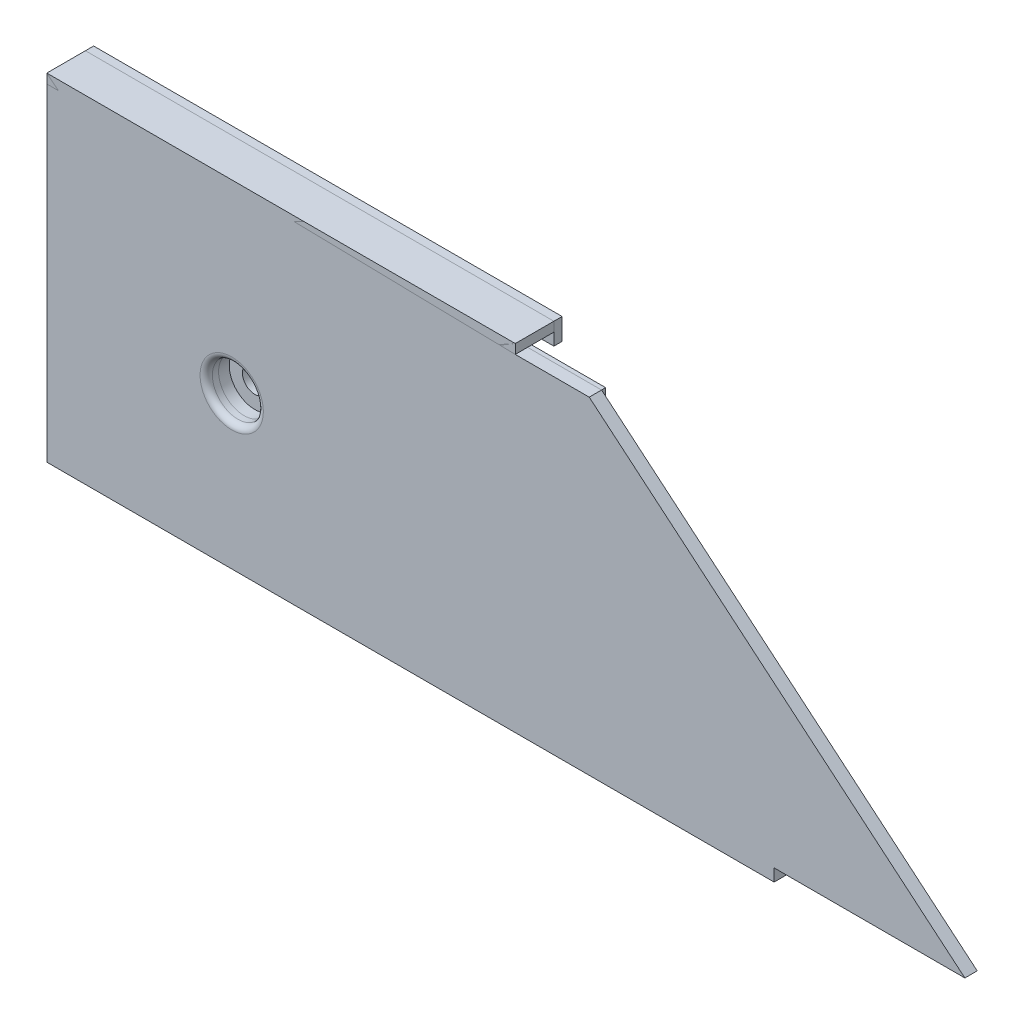
ISO-10303-21;
HEADER;
FILE_DESCRIPTION(('STEP AP214'),'2;1');
FILE_NAME('part.step','',(''),(''),'','','');
FILE_SCHEMA(('AUTOMOTIVE_DESIGN { 1 0 10303 214 1 1 1 1 }'));
ENDSEC;
DATA;
#1=APPLICATION_CONTEXT('core data for automotive mechanical design processes');
#2=APPLICATION_PROTOCOL_DEFINITION('international standard','automotive_design',2000,#1);
#3=PRODUCT_CONTEXT('',#1,'mechanical');
#4=PRODUCT('Part','Part','',(#3));
#5=PRODUCT_RELATED_PRODUCT_CATEGORY('part','',(#4));
#6=PRODUCT_DEFINITION_FORMATION('','',#4);
#7=PRODUCT_DEFINITION_CONTEXT('part definition',#1,'design');
#8=PRODUCT_DEFINITION('design','',#6,#7);
#9=PRODUCT_DEFINITION_SHAPE('','',#8);
#10=(LENGTH_UNIT() NAMED_UNIT(*) SI_UNIT(.MILLI.,.METRE.));
#11=(NAMED_UNIT(*) PLANE_ANGLE_UNIT() SI_UNIT($,.RADIAN.));
#12=(NAMED_UNIT(*) SI_UNIT($,.STERADIAN.) SOLID_ANGLE_UNIT());
#13=UNCERTAINTY_MEASURE_WITH_UNIT(LENGTH_MEASURE(1.E-05),#10,'distance_accuracy_value','');
#14=(GEOMETRIC_REPRESENTATION_CONTEXT(3) GLOBAL_UNCERTAINTY_ASSIGNED_CONTEXT((#13)) GLOBAL_UNIT_ASSIGNED_CONTEXT((#10,
#11,#12)) REPRESENTATION_CONTEXT('',''));
#15=CARTESIAN_POINT('',(0.,0.,0.));
#16=DIRECTION('',(0.,0.,1.));
#17=DIRECTION('',(1.,0.,0.));
#18=AXIS2_PLACEMENT_3D('',#15,#16,#17);
#19=CARTESIAN_POINT('',(-45.161548339987,41.0018984659563,-4.2));
#20=DIRECTION('',(-1.,0.,0.));
#21=DIRECTION('',(0.,0.,1.));
#22=AXIS2_PLACEMENT_3D('',#19,#20,#21);
#23=PLANE('',#22);
#24=DIRECTION('',(0.,-1.,0.));
#25=VECTOR('',#24,1.);
#26=CARTESIAN_POINT('',(-45.161548339987,41.0018984659563,-3.2));
#27=LINE('',#26,#25);
#28=CARTESIAN_POINT('',(-45.161548339987,41.0018984659563,-3.2));
#29=VERTEX_POINT('',#28);
#30=CARTESIAN_POINT('',(-45.161548339987,38.3714757057615,-3.2));
#31=VERTEX_POINT('',#30);
#32=EDGE_CURVE('E109',#29,#31,#27,.T.);
#33=ORIENTED_EDGE('',*,*,#32,.T.);
#34=DIRECTION('',(0.,0.,1.));
#35=VECTOR('',#34,1.);
#36=CARTESIAN_POINT('',(-45.161548339987,38.3714757057615,-4.2));
#37=LINE('',#36,#35);
#38=CARTESIAN_POINT('',(-45.161548339987,38.3714757057615,-4.2));
#39=VERTEX_POINT('',#38);
#40=EDGE_CURVE('E12',#39,#31,#37,.T.);
#41=ORIENTED_EDGE('',*,*,#40,.F.);
#42=DIRECTION('',(0.,-1.,0.));
#43=VECTOR('',#42,1.);
#44=CARTESIAN_POINT('',(-45.161548339987,41.0018984659563,-4.2));
#45=LINE('',#44,#43);
#46=CARTESIAN_POINT('',(-45.161548339987,41.0018984659563,-4.2));
#47=VERTEX_POINT('',#46);
#48=EDGE_CURVE('E97',#47,#39,#45,.T.);
#49=ORIENTED_EDGE('',*,*,#48,.F.);
#50=DIRECTION('',(0.,0.,1.));
#51=VECTOR('',#50,1.);
#52=CARTESIAN_POINT('',(-45.161548339987,41.0018984659563,-4.2));
#53=LINE('',#52,#51);
#54=EDGE_CURVE('E105',#47,#29,#53,.T.);
#55=ORIENTED_EDGE('',*,*,#54,.T.);
#56=EDGE_LOOP('',(#33,#41,#49,#55));
#57=FACE_BOUND('',#56,.T.);
#58=ADVANCED_FACE('F46',(#57),#23,.F.);
#59=CARTESIAN_POINT('',(-45.161548339987,38.3714757057615,-4.2));
#60=DIRECTION('',(0.,1.,0.));
#61=DIRECTION('',(0.,0.,1.));
#62=AXIS2_PLACEMENT_3D('',#59,#60,#61);
#63=PLANE('',#62);
#64=DIRECTION('',(-1.,0.,0.));
#65=VECTOR('',#64,1.);
#66=CARTESIAN_POINT('',(-45.161548339987,38.3714757057615,-3.2));
#67=LINE('',#66,#65);
#68=CARTESIAN_POINT('',(-102.161548339987,38.3714757057615,-3.2));
#69=VERTEX_POINT('',#68);
#70=EDGE_CURVE('E101',#31,#69,#67,.T.);
#71=ORIENTED_EDGE('',*,*,#70,.T.);
#72=DIRECTION('',(0.,0.,1.));
#73=VECTOR('',#72,1.);
#74=CARTESIAN_POINT('',(-102.161548339987,38.3714757057615,-4.2));
#75=LINE('',#74,#73);
#76=CARTESIAN_POINT('',(-102.161548339987,38.3714757057615,-4.2));
#77=VERTEX_POINT('',#76);
#78=EDGE_CURVE('E54',#77,#69,#75,.T.);
#79=ORIENTED_EDGE('',*,*,#78,.F.);
#80=DIRECTION('',(-1.,0.,0.));
#81=VECTOR('',#80,1.);
#82=CARTESIAN_POINT('',(-45.161548339987,38.3714757057615,-4.2));
#83=LINE('',#82,#81);
#84=EDGE_CURVE('E92',#39,#77,#83,.T.);
#85=ORIENTED_EDGE('',*,*,#84,.F.);
#86=ORIENTED_EDGE('',*,*,#40,.T.);
#87=EDGE_LOOP('',(#71,#79,#85,#86));
#88=FACE_BOUND('',#87,.T.);
#89=ADVANCED_FACE('F100',(#88),#63,.F.);
#90=CARTESIAN_POINT('',(-102.161548339987,41.0018984659563,-4.2));
#91=DIRECTION('',(1.,0.,0.));
#92=DIRECTION('',(0.,0.,-1.));
#93=AXIS2_PLACEMENT_3D('',#90,#91,#92);
#94=PLANE('',#93);
#95=DIRECTION('',(0.,1.,0.));
#96=VECTOR('',#95,1.);
#97=CARTESIAN_POINT('',(-102.161548339987,41.0018984659563,-3.2));
#98=LINE('',#97,#96);
#99=CARTESIAN_POINT('',(-102.161548339987,41.0018984659563,-3.2));
#100=VERTEX_POINT('',#99);
#101=EDGE_CURVE('E79',#69,#100,#98,.T.);
#102=ORIENTED_EDGE('',*,*,#101,.T.);
#103=DIRECTION('',(0.,0.,1.));
#104=VECTOR('',#103,1.);
#105=CARTESIAN_POINT('',(-102.161548339987,41.0018984659563,-4.2));
#106=LINE('',#105,#104);
#107=CARTESIAN_POINT('',(-102.161548339987,41.0018984659563,-4.2));
#108=VERTEX_POINT('',#107);
#109=EDGE_CURVE('E102',#108,#100,#106,.T.);
#110=ORIENTED_EDGE('',*,*,#109,.F.);
#111=DIRECTION('',(0.,1.,0.));
#112=VECTOR('',#111,1.);
#113=CARTESIAN_POINT('',(-102.161548339987,41.0018984659563,-4.2));
#114=LINE('',#113,#112);
#115=EDGE_CURVE('E95',#77,#108,#114,.T.);
#116=ORIENTED_EDGE('',*,*,#115,.F.);
#117=ORIENTED_EDGE('',*,*,#78,.T.);
#118=EDGE_LOOP('',(#102,#110,#116,#117));
#119=FACE_BOUND('',#118,.T.);
#120=ADVANCED_FACE('F103',(#119),#94,.F.);
#121=CARTESIAN_POINT('',(-45.161548339987,41.0018984659563,-4.2));
#122=DIRECTION('',(0.,-1.,0.));
#123=DIRECTION('',(0.,0.,-1.));
#124=AXIS2_PLACEMENT_3D('',#121,#122,#123);
#125=PLANE('',#124);
#126=DIRECTION('',(1.,0.,0.));
#127=VECTOR('',#126,1.);
#128=CARTESIAN_POINT('',(-45.161548339987,41.0018984659563,-3.2));
#129=LINE('',#128,#127);
#130=EDGE_CURVE('E85',#100,#29,#129,.T.);
#131=ORIENTED_EDGE('',*,*,#130,.T.);
#132=ORIENTED_EDGE('',*,*,#54,.F.);
#133=DIRECTION('',(1.,0.,0.));
#134=VECTOR('',#133,1.);
#135=CARTESIAN_POINT('',(-45.161548339987,41.0018984659563,-4.2));
#136=LINE('',#135,#134);
#137=EDGE_CURVE('E62',#108,#47,#136,.T.);
#138=ORIENTED_EDGE('',*,*,#137,.F.);
#139=ORIENTED_EDGE('',*,*,#109,.T.);
#140=EDGE_LOOP('',(#131,#132,#138,#139));
#141=FACE_BOUND('',#140,.T.);
#142=ADVANCED_FACE('F116',(#141),#125,.F.);
#143=CARTESIAN_POINT('',(0.,0.,-4.2));
#144=DIRECTION('',(0.,0.,-1.));
#145=DIRECTION('',(-1.,0.,0.));
#146=AXIS2_PLACEMENT_3D('',#143,#144,#145);
#147=PLANE('',#146);
#148=ORIENTED_EDGE('',*,*,#48,.T.);
#149=ORIENTED_EDGE('',*,*,#84,.T.);
#150=ORIENTED_EDGE('',*,*,#115,.T.);
#151=ORIENTED_EDGE('',*,*,#137,.T.);
#152=EDGE_LOOP('',(#148,#149,#150,#151));
#153=FACE_BOUND('',#152,.T.);
#154=ADVANCED_FACE('F93',(#153),#147,.T.);
#155=CARTESIAN_POINT('',(0.,0.,-3.2));
#156=DIRECTION('',(0.,0.,-1.));
#157=DIRECTION('',(-1.,0.,0.));
#158=AXIS2_PLACEMENT_3D('',#155,#156,#157);
#159=PLANE('',#158);
#160=ORIENTED_EDGE('',*,*,#32,.F.);
#161=ORIENTED_EDGE('',*,*,#130,.F.);
#162=ORIENTED_EDGE('',*,*,#101,.F.);
#163=ORIENTED_EDGE('',*,*,#70,.F.);
#164=EDGE_LOOP('',(#160,#161,#162,#163));
#165=FACE_BOUND('',#164,.T.);
#166=ADVANCED_FACE('F119',(#165),#159,.F.);
#167=CLOSED_SHELL('',(#58,#89,#120,#142,#154,#166));
#168=MANIFOLD_SOLID_BREP('B2',#167);
#169=CARTESIAN_POINT('',(-45.161548339987,39.8528318012778,-0.5));
#170=DIRECTION('',(1.,0.,0.));
#171=DIRECTION('',(0.,0.,-1.));
#172=AXIS2_PLACEMENT_3D('',#169,#170,#171);
#173=PLANE('',#172);
#174=DIRECTION('',(0.,1.,0.));
#175=VECTOR('',#174,1.);
#176=CARTESIAN_POINT('',(-45.161548339987,39.8528318012778,0.));
#177=LINE('',#176,#175);
#178=CARTESIAN_POINT('',(-45.161548339987,38.3528318012778,0.));
#179=VERTEX_POINT('',#178);
#180=CARTESIAN_POINT('',(-45.161548339987,39.8528318012778,0.));
#181=VERTEX_POINT('',#180);
#182=EDGE_CURVE('E243',#179,#181,#177,.T.);
#183=ORIENTED_EDGE('',*,*,#182,.T.);
#184=DIRECTION('',(0.,0.,1.));
#185=VECTOR('',#184,1.);
#186=CARTESIAN_POINT('',(-45.161548339987,39.8528318012778,-0.5));
#187=LINE('',#186,#185);
#188=CARTESIAN_POINT('',(-45.161548339987,39.8528318012778,-0.5));
#189=VERTEX_POINT('',#188);
#190=EDGE_CURVE('E44',#189,#181,#187,.T.);
#191=ORIENTED_EDGE('',*,*,#190,.F.);
#192=DIRECTION('',(0.,1.,0.));
#193=VECTOR('',#192,1.);
#194=CARTESIAN_POINT('',(-45.161548339987,39.8528318012778,-0.5));
#195=LINE('',#194,#193);
#196=CARTESIAN_POINT('',(-45.161548339987,38.3528318012778,-0.5));
#197=VERTEX_POINT('',#196);
#198=EDGE_CURVE('E231',#197,#189,#195,.T.);
#199=ORIENTED_EDGE('',*,*,#198,.F.);
#200=DIRECTION('',(0.,0.,1.));
#201=VECTOR('',#200,1.);
#202=CARTESIAN_POINT('',(-45.161548339987,38.3528318012778,-0.5));
#203=LINE('',#202,#201);
#204=EDGE_CURVE('E239',#197,#179,#203,.T.);
#205=ORIENTED_EDGE('',*,*,#204,.T.);
#206=EDGE_LOOP('',(#183,#191,#199,#205));
#207=FACE_BOUND('',#206,.T.);
#208=ADVANCED_FACE('F180',(#207),#173,.F.);
#209=CARTESIAN_POINT('',(-45.161548339987,39.8528318012778,-0.5));
#210=DIRECTION('',(0.,-1.,0.));
#211=DIRECTION('',(0.,0.,-1.));
#212=AXIS2_PLACEMENT_3D('',#209,#210,#211);
#213=PLANE('',#212);
#214=DIRECTION('',(1.,0.,0.));
#215=VECTOR('',#214,1.);
#216=CARTESIAN_POINT('',(-45.161548339987,39.8528318012778,0.));
#217=LINE('',#216,#215);
#218=CARTESIAN_POINT('',(-36.1615483445168,39.8528318012778,0.));
#219=VERTEX_POINT('',#218);
#220=EDGE_CURVE('E235',#181,#219,#217,.T.);
#221=ORIENTED_EDGE('',*,*,#220,.T.);
#222=DIRECTION('',(0.,0.,1.));
#223=VECTOR('',#222,1.);
#224=CARTESIAN_POINT('',(-36.1615483445168,39.8528318012778,-0.5));
#225=LINE('',#224,#223);
#226=CARTESIAN_POINT('',(-36.1615483445168,39.8528318012778,-0.5));
#227=VERTEX_POINT('',#226);
#228=EDGE_CURVE('E188',#227,#219,#225,.T.);
#229=ORIENTED_EDGE('',*,*,#228,.F.);
#230=DIRECTION('',(1.,0.,0.));
#231=VECTOR('',#230,1.);
#232=CARTESIAN_POINT('',(-45.161548339987,39.8528318012778,-0.5));
#233=LINE('',#232,#231);
#234=EDGE_CURVE('E226',#189,#227,#233,.T.);
#235=ORIENTED_EDGE('',*,*,#234,.F.);
#236=ORIENTED_EDGE('',*,*,#190,.T.);
#237=EDGE_LOOP('',(#221,#229,#235,#236));
#238=FACE_BOUND('',#237,.T.);
#239=ADVANCED_FACE('F234',(#238),#213,.F.);
#240=CARTESIAN_POINT('',(-36.1615483445168,39.8528318012778,-0.5));
#241=DIRECTION('',(-1.,0.,0.));
#242=DIRECTION('',(0.,0.,1.));
#243=AXIS2_PLACEMENT_3D('',#240,#241,#242);
#244=PLANE('',#243);
#245=DIRECTION('',(0.,-1.,0.));
#246=VECTOR('',#245,1.);
#247=CARTESIAN_POINT('',(-36.1615483445168,39.8528318012778,0.));
#248=LINE('',#247,#246);
#249=CARTESIAN_POINT('',(-36.1615483445168,38.3528318012778,0.));
#250=VERTEX_POINT('',#249);
#251=EDGE_CURVE('E213',#219,#250,#248,.T.);
#252=ORIENTED_EDGE('',*,*,#251,.T.);
#253=DIRECTION('',(0.,0.,1.));
#254=VECTOR('',#253,1.);
#255=CARTESIAN_POINT('',(-36.1615483445168,38.3528318012778,-0.5));
#256=LINE('',#255,#254);
#257=CARTESIAN_POINT('',(-36.1615483445168,38.3528318012778,-0.5));
#258=VERTEX_POINT('',#257);
#259=EDGE_CURVE('E236',#258,#250,#256,.T.);
#260=ORIENTED_EDGE('',*,*,#259,.F.);
#261=DIRECTION('',(0.,-1.,0.));
#262=VECTOR('',#261,1.);
#263=CARTESIAN_POINT('',(-36.1615483445168,39.8528318012778,-0.5));
#264=LINE('',#263,#262);
#265=EDGE_CURVE('E229',#227,#258,#264,.T.);
#266=ORIENTED_EDGE('',*,*,#265,.F.);
#267=ORIENTED_EDGE('',*,*,#228,.T.);
#268=EDGE_LOOP('',(#252,#260,#266,#267));
#269=FACE_BOUND('',#268,.T.);
#270=ADVANCED_FACE('F237',(#269),#244,.F.);
#271=CARTESIAN_POINT('',(-45.161548339987,38.3528318012778,-0.5));
#272=DIRECTION('',(0.,1.,0.));
#273=DIRECTION('',(0.,0.,1.));
#274=AXIS2_PLACEMENT_3D('',#271,#272,#273);
#275=PLANE('',#274);
#276=DIRECTION('',(-1.,0.,0.));
#277=VECTOR('',#276,1.);
#278=CARTESIAN_POINT('',(-45.161548339987,38.3528318012778,0.));
#279=LINE('',#278,#277);
#280=EDGE_CURVE('E219',#250,#179,#279,.T.);
#281=ORIENTED_EDGE('',*,*,#280,.T.);
#282=ORIENTED_EDGE('',*,*,#204,.F.);
#283=DIRECTION('',(-1.,0.,0.));
#284=VECTOR('',#283,1.);
#285=CARTESIAN_POINT('',(-45.161548339987,38.3528318012778,-0.5));
#286=LINE('',#285,#284);
#287=EDGE_CURVE('E196',#258,#197,#286,.T.);
#288=ORIENTED_EDGE('',*,*,#287,.F.);
#289=ORIENTED_EDGE('',*,*,#259,.T.);
#290=EDGE_LOOP('',(#281,#282,#288,#289));
#291=FACE_BOUND('',#290,.T.);
#292=ADVANCED_FACE('F250',(#291),#275,.F.);
#293=CARTESIAN_POINT('',(0.,0.,-0.5));
#294=DIRECTION('',(0.,0.,1.));
#295=DIRECTION('',(1.,0.,0.));
#296=AXIS2_PLACEMENT_3D('',#293,#294,#295);
#297=PLANE('',#296);
#298=ORIENTED_EDGE('',*,*,#198,.T.);
#299=ORIENTED_EDGE('',*,*,#234,.T.);
#300=ORIENTED_EDGE('',*,*,#265,.T.);
#301=ORIENTED_EDGE('',*,*,#287,.T.);
#302=EDGE_LOOP('',(#298,#299,#300,#301));
#303=FACE_BOUND('',#302,.T.);
#304=ADVANCED_FACE('F227',(#303),#297,.F.);
#305=CARTESIAN_POINT('',(0.,0.,0.));
#306=DIRECTION('',(0.,0.,1.));
#307=DIRECTION('',(1.,0.,0.));
#308=AXIS2_PLACEMENT_3D('',#305,#306,#307);
#309=PLANE('',#308);
#310=ORIENTED_EDGE('',*,*,#182,.F.);
#311=ORIENTED_EDGE('',*,*,#280,.F.);
#312=ORIENTED_EDGE('',*,*,#251,.F.);
#313=ORIENTED_EDGE('',*,*,#220,.F.);
#314=EDGE_LOOP('',(#310,#311,#312,#313));
#315=FACE_BOUND('',#314,.T.);
#316=ADVANCED_FACE('F253',(#315),#309,.T.);
#317=CLOSED_SHELL('',(#208,#239,#270,#292,#304,#316));
#318=MANIFOLD_SOLID_BREP('B6',#317);
#319=CARTESIAN_POINT('',(-45.161548339987,39.8528318012778,-3.2));
#320=DIRECTION('',(1.,0.,0.));
#321=DIRECTION('',(0.,0.,-1.));
#322=AXIS2_PLACEMENT_3D('',#319,#320,#321);
#323=PLANE('',#322);
#324=DIRECTION('',(0.,1.,0.));
#325=VECTOR('',#324,1.);
#326=CARTESIAN_POINT('',(-45.161548339987,39.8528318012778,1.5));
#327=LINE('',#326,#325);
#328=CARTESIAN_POINT('',(-45.161548339987,39.8528318012778,1.5));
#329=VERTEX_POINT('',#328);
#330=CARTESIAN_POINT('',(-45.161548339987,41.0018984659563,1.5));
#331=VERTEX_POINT('',#330);
#332=EDGE_CURVE('E376',#329,#331,#327,.T.);
#333=ORIENTED_EDGE('',*,*,#332,.F.);
#334=DIRECTION('',(0.,0.,1.));
#335=VECTOR('',#334,1.);
#336=CARTESIAN_POINT('',(-45.161548339987,39.8528318012778,-3.2));
#337=LINE('',#336,#335);
#338=CARTESIAN_POINT('',(-45.161548339987,39.8528318012778,-3.2));
#339=VERTEX_POINT('',#338);
#340=EDGE_CURVE('E178',#339,#329,#337,.T.);
#341=ORIENTED_EDGE('',*,*,#340,.F.);
#342=DIRECTION('',(0.,1.,0.));
#343=VECTOR('',#342,1.);
#344=CARTESIAN_POINT('',(-45.161548339987,39.8528318012778,-3.2));
#345=LINE('',#344,#343);
#346=CARTESIAN_POINT('',(-45.161548339987,41.0018984659563,-3.2));
#347=VERTEX_POINT('',#346);
#348=EDGE_CURVE('E370',#339,#347,#345,.T.);
#349=ORIENTED_EDGE('',*,*,#348,.T.);
#350=DIRECTION('',(0.,0.,1.));
#351=VECTOR('',#350,1.);
#352=CARTESIAN_POINT('',(-45.161548339987,41.0018984659563,-3.2));
#353=LINE('',#352,#351);
#354=EDGE_CURVE('E315',#347,#331,#353,.T.);
#355=ORIENTED_EDGE('',*,*,#354,.T.);
#356=EDGE_LOOP('',(#333,#341,#349,#355));
#357=FACE_BOUND('',#356,.T.);
#358=ADVANCED_FACE('F312',(#357),#323,.T.);
#359=CARTESIAN_POINT('',(-45.161548339987,39.8528318012778,-3.2));
#360=DIRECTION('',(0.,-1.,0.));
#361=DIRECTION('',(0.,0.,-1.));
#362=AXIS2_PLACEMENT_3D('',#359,#360,#361);
#363=PLANE('',#362);
#364=DIRECTION('',(1.,0.,0.));
#365=VECTOR('',#364,1.);
#366=CARTESIAN_POINT('',(-45.161548339987,39.8528318012778,1.5));
#367=LINE('',#366,#365);
#368=CARTESIAN_POINT('',(-102.161548339987,39.8528318012778,1.5));
#369=VERTEX_POINT('',#368);
#370=EDGE_CURVE('E372',#369,#329,#367,.T.);
#371=ORIENTED_EDGE('',*,*,#370,.F.);
#372=DIRECTION('',(0.,0.,1.));
#373=VECTOR('',#372,1.);
#374=CARTESIAN_POINT('',(-102.161548339987,39.8528318012778,-3.2));
#375=LINE('',#374,#373);
#376=CARTESIAN_POINT('',(-102.161548339987,39.8528318012778,-3.2));
#377=VERTEX_POINT('',#376);
#378=EDGE_CURVE('E321',#377,#369,#375,.T.);
#379=ORIENTED_EDGE('',*,*,#378,.F.);
#380=DIRECTION('',(1.,0.,0.));
#381=VECTOR('',#380,1.);
#382=CARTESIAN_POINT('',(-45.161548339987,39.8528318012778,-3.2));
#383=LINE('',#382,#381);
#384=EDGE_CURVE('E367',#377,#339,#383,.T.);
#385=ORIENTED_EDGE('',*,*,#384,.T.);
#386=ORIENTED_EDGE('',*,*,#340,.T.);
#387=EDGE_LOOP('',(#371,#379,#385,#386));
#388=FACE_BOUND('',#387,.T.);
#389=ADVANCED_FACE('F386',(#388),#363,.T.);
#390=CARTESIAN_POINT('',(-102.161548339987,39.8528318012778,-3.2));
#391=DIRECTION('',(-1.,0.,0.));
#392=DIRECTION('',(0.,0.,1.));
#393=AXIS2_PLACEMENT_3D('',#390,#391,#392);
#394=PLANE('',#393);
#395=DIRECTION('',(0.,-1.,0.));
#396=VECTOR('',#395,1.);
#397=CARTESIAN_POINT('',(-102.161548339987,39.8528318012778,1.5));
#398=LINE('',#397,#396);
#399=CARTESIAN_POINT('',(-102.161548339987,41.0018984659563,1.5));
#400=VERTEX_POINT('',#399);
#401=EDGE_CURVE('E362',#400,#369,#398,.T.);
#402=ORIENTED_EDGE('',*,*,#401,.F.);
#403=DIRECTION('',(0.,0.,1.));
#404=VECTOR('',#403,1.);
#405=CARTESIAN_POINT('',(-102.161548339987,41.0018984659563,-3.2));
#406=LINE('',#405,#404);
#407=CARTESIAN_POINT('',(-102.161548339987,41.0018984659563,-3.2));
#408=VERTEX_POINT('',#407);
#409=EDGE_CURVE('E357',#408,#400,#406,.T.);
#410=ORIENTED_EDGE('',*,*,#409,.F.);
#411=DIRECTION('',(0.,-1.,0.));
#412=VECTOR('',#411,1.);
#413=CARTESIAN_POINT('',(-102.161548339987,39.8528318012778,-3.2));
#414=LINE('',#413,#412);
#415=EDGE_CURVE('E360',#408,#377,#414,.T.);
#416=ORIENTED_EDGE('',*,*,#415,.T.);
#417=ORIENTED_EDGE('',*,*,#378,.T.);
#418=EDGE_LOOP('',(#402,#410,#416,#417));
#419=FACE_BOUND('',#418,.T.);
#420=ADVANCED_FACE('F359',(#419),#394,.T.);
#421=CARTESIAN_POINT('',(-45.161548339987,41.0018984659563,-3.2));
#422=DIRECTION('',(0.,1.,0.));
#423=DIRECTION('',(0.,0.,1.));
#424=AXIS2_PLACEMENT_3D('',#421,#422,#423);
#425=PLANE('',#424);
#426=DIRECTION('',(-1.,0.,0.));
#427=VECTOR('',#426,1.);
#428=CARTESIAN_POINT('',(-45.161548339987,41.0018984659563,1.5));
#429=LINE('',#428,#427);
#430=EDGE_CURVE('E379',#331,#400,#429,.T.);
#431=ORIENTED_EDGE('',*,*,#430,.F.);
#432=ORIENTED_EDGE('',*,*,#354,.F.);
#433=DIRECTION('',(-1.,0.,0.));
#434=VECTOR('',#433,1.);
#435=CARTESIAN_POINT('',(-45.161548339987,41.0018984659563,-3.2));
#436=LINE('',#435,#434);
#437=EDGE_CURVE('E366',#347,#408,#436,.T.);
#438=ORIENTED_EDGE('',*,*,#437,.T.);
#439=ORIENTED_EDGE('',*,*,#409,.T.);
#440=EDGE_LOOP('',(#431,#432,#438,#439));
#441=FACE_BOUND('',#440,.T.);
#442=ADVANCED_FACE('F369',(#441),#425,.T.);
#443=CARTESIAN_POINT('',(0.,0.,-3.2));
#444=DIRECTION('',(0.,0.,1.));
#445=DIRECTION('',(1.,0.,0.));
#446=AXIS2_PLACEMENT_3D('',#443,#444,#445);
#447=PLANE('',#446);
#448=ORIENTED_EDGE('',*,*,#348,.F.);
#449=ORIENTED_EDGE('',*,*,#384,.F.);
#450=ORIENTED_EDGE('',*,*,#415,.F.);
#451=ORIENTED_EDGE('',*,*,#437,.F.);
#452=EDGE_LOOP('',(#448,#449,#450,#451));
#453=FACE_BOUND('',#452,.T.);
#454=ADVANCED_FACE('F365',(#453),#447,.F.);
#455=CARTESIAN_POINT('',(0.,0.,1.5));
#456=DIRECTION('',(0.,0.,1.));
#457=DIRECTION('',(1.,0.,0.));
#458=AXIS2_PLACEMENT_3D('',#455,#456,#457);
#459=PLANE('',#458);
#460=ORIENTED_EDGE('',*,*,#332,.T.);
#461=ORIENTED_EDGE('',*,*,#430,.T.);
#462=ORIENTED_EDGE('',*,*,#401,.T.);
#463=ORIENTED_EDGE('',*,*,#370,.T.);
#464=EDGE_LOOP('',(#460,#461,#462,#463));
#465=FACE_BOUND('',#464,.T.);
#466=ADVANCED_FACE('F385',(#465),#459,.T.);
#467=CLOSED_SHELL('',(#358,#389,#420,#442,#454,#466));
#468=MANIFOLD_SOLID_BREP('B38',#467);
#469=CARTESIAN_POINT('',(-79.661548339987,18.5,-3.));
#470=DIRECTION('',(0.,0.,1.));
#471=DIRECTION('',(1.,0.,0.));
#472=AXIS2_PLACEMENT_3D('',#469,#470,#471);
#473=CYLINDRICAL_SURFACE('',#472,1.5);
#474=CARTESIAN_POINT('',(-79.661548339987,18.5,-3.));
#475=DIRECTION('',(0.,0.,1.));
#476=DIRECTION('',(1.,0.,0.));
#477=AXIS2_PLACEMENT_3D('',#474,#475,#476);
#478=CIRCLE('',#477,1.5);
#479=CARTESIAN_POINT('',(-78.161548339987,18.5,-3.));
#480=VERTEX_POINT('',#479);
#481=EDGE_CURVE('E459',#480,#480,#478,.T.);
#482=ORIENTED_EDGE('',*,*,#481,.F.);
#483=EDGE_LOOP('',(#482));
#484=FACE_BOUND('',#483,.T.);
#485=CARTESIAN_POINT('',(-79.661548339987,18.5,-1.3));
#486=DIRECTION('',(0.,0.,1.));
#487=DIRECTION('',(1.,0.,0.));
#488=AXIS2_PLACEMENT_3D('',#485,#486,#487);
#489=CIRCLE('',#488,1.5);
#490=CARTESIAN_POINT('',(-78.161548339987,18.5,-1.3));
#491=VERTEX_POINT('',#490);
#492=EDGE_CURVE('E463',#491,#491,#489,.F.);
#493=ORIENTED_EDGE('',*,*,#492,.F.);
#494=EDGE_LOOP('',(#493));
#495=FACE_BOUND('',#494,.T.);
#496=ADVANCED_FACE('F446',(#484,#495),#473,.F.);
#497=CARTESIAN_POINT('',(-79.661548339987,18.5,-3.));
#498=DIRECTION('',(0.,0.,1.));
#499=DIRECTION('',(1.,0.,0.));
#500=AXIS2_PLACEMENT_3D('',#497,#498,#499);
#501=CYLINDRICAL_SURFACE('',#500,3.4);
#502=CARTESIAN_POINT('',(-79.661548339987,18.5,-3.));
#503=DIRECTION('',(0.,0.,-1.));
#504=DIRECTION('',(-1.,0.,0.));
#505=AXIS2_PLACEMENT_3D('',#502,#503,#504);
#506=CIRCLE('',#505,3.4);
#507=CARTESIAN_POINT('',(-83.061548339987,18.5,-3.));
#508=VERTEX_POINT('',#507);
#509=EDGE_CURVE('E311',#508,#508,#506,.T.);
#510=ORIENTED_EDGE('',*,*,#509,.F.);
#511=EDGE_LOOP('',(#510));
#512=FACE_BOUND('',#511,.T.);
#513=CARTESIAN_POINT('',(-79.661548339987,18.5,0.));
#514=DIRECTION('',(0.,0.,-1.));
#515=DIRECTION('',(-1.,0.,0.));
#516=AXIS2_PLACEMENT_3D('',#513,#514,#515);
#517=CIRCLE('',#516,3.4);
#518=CARTESIAN_POINT('',(-83.061548339987,18.5,0.));
#519=VERTEX_POINT('',#518);
#520=EDGE_CURVE('E454',#519,#519,#517,.T.);
#521=ORIENTED_EDGE('',*,*,#520,.T.);
#522=EDGE_LOOP('',(#521));
#523=FACE_BOUND('',#522,.T.);
#524=ADVANCED_FACE('F448',(#512,#523),#501,.T.);
#525=CARTESIAN_POINT('',(-79.661548339987,18.5,-3.));
#526=DIRECTION('',(0.,0.,-1.));
#527=DIRECTION('',(-1.,0.,0.));
#528=AXIS2_PLACEMENT_3D('',#525,#526,#527);
#529=PLANE('',#528);
#530=ORIENTED_EDGE('',*,*,#481,.T.);
#531=EDGE_LOOP('',(#530));
#532=FACE_BOUND('',#531,.T.);
#533=ORIENTED_EDGE('',*,*,#509,.T.);
#534=EDGE_LOOP('',(#533));
#535=FACE_BOUND('',#534,.T.);
#536=ADVANCED_FACE('F483',(#532,#535),#529,.T.);
#537=CARTESIAN_POINT('',(-79.661548339987,18.5,0.));
#538=DIRECTION('',(0.,0.,-1.));
#539=DIRECTION('',(-1.,0.,0.));
#540=AXIS2_PLACEMENT_3D('',#537,#538,#539);
#541=PLANE('',#540);
#542=CARTESIAN_POINT('',(-79.661548339987,18.5,0.));
#543=DIRECTION('',(0.,0.,-1.));
#544=DIRECTION('',(-1.,0.,0.));
#545=AXIS2_PLACEMENT_3D('',#542,#543,#544);
#546=CIRCLE('',#545,3.1);
#547=CARTESIAN_POINT('',(-82.761548339987,18.5,0.));
#548=VERTEX_POINT('',#547);
#549=EDGE_CURVE('E450',#548,#548,#546,.T.);
#550=ORIENTED_EDGE('',*,*,#549,.T.);
#551=EDGE_LOOP('',(#550));
#552=FACE_BOUND('',#551,.T.);
#553=ORIENTED_EDGE('',*,*,#520,.F.);
#554=EDGE_LOOP('',(#553));
#555=FACE_BOUND('',#554,.T.);
#556=ADVANCED_FACE('F477',(#552,#555),#541,.F.);
#557=CARTESIAN_POINT('',(-79.661548339987,18.5,-1.3));
#558=DIRECTION('',(0.,0.,1.));
#559=DIRECTION('',(1.,0.,0.));
#560=AXIS2_PLACEMENT_3D('',#557,#558,#559);
#561=CYLINDRICAL_SURFACE('',#560,3.1);
#562=CARTESIAN_POINT('',(-79.661548339987,18.5,-1.3));
#563=DIRECTION('',(0.,0.,1.));
#564=DIRECTION('',(1.,0.,0.));
#565=AXIS2_PLACEMENT_3D('',#562,#563,#564);
#566=CIRCLE('',#565,3.1);
#567=CARTESIAN_POINT('',(-76.561548339987,18.5,-1.3));
#568=VERTEX_POINT('',#567);
#569=EDGE_CURVE('E465',#568,#568,#566,.T.);
#570=ORIENTED_EDGE('',*,*,#569,.F.);
#571=EDGE_LOOP('',(#570));
#572=FACE_BOUND('',#571,.T.);
#573=ORIENTED_EDGE('',*,*,#549,.F.);
#574=EDGE_LOOP('',(#573));
#575=FACE_BOUND('',#574,.T.);
#576=ADVANCED_FACE('F474',(#572,#575),#561,.F.);
#577=CARTESIAN_POINT('',(-79.661548339987,18.5,-1.3));
#578=DIRECTION('',(0.,0.,1.));
#579=DIRECTION('',(1.,0.,0.));
#580=AXIS2_PLACEMENT_3D('',#577,#578,#579);
#581=PLANE('',#580);
#582=ORIENTED_EDGE('',*,*,#569,.T.);
#583=EDGE_LOOP('',(#582));
#584=FACE_BOUND('',#583,.T.);
#585=ORIENTED_EDGE('',*,*,#492,.T.);
#586=EDGE_LOOP('',(#585));
#587=FACE_BOUND('',#586,.T.);
#588=ADVANCED_FACE('F472',(#584,#587),#581,.T.);
#589=CLOSED_SHELL('',(#496,#524,#536,#556,#576,#588));
#590=MANIFOLD_SOLID_BREP('B172',#589);
#591=CARTESIAN_POINT('',(0.,0.,1.5));
#592=DIRECTION('',(0.,0.,1.));
#593=DIRECTION('',(1.,0.,0.));
#594=AXIS2_PLACEMENT_3D('',#591,#592,#593);
#595=PLANE('',#594);
#596=CARTESIAN_POINT('',(-79.661548339987,18.5,1.5));
#597=DIRECTION('',(0.,0.,1.));
#598=DIRECTION('',(1.,0.,0.));
#599=AXIS2_PLACEMENT_3D('',#596,#597,#598);
#600=CIRCLE('',#599,3.85);
#601=CARTESIAN_POINT('',(-75.811548339987,18.5,1.5));
#602=VERTEX_POINT('',#601);
#603=EDGE_CURVE('E444',#602,#602,#600,.F.);
#604=ORIENTED_EDGE('',*,*,#603,.T.);
#605=EDGE_LOOP('',(#604));
#606=FACE_BOUND('',#605,.T.);
#607=DIRECTION('',(1.,0.,0.));
#608=VECTOR('',#607,1.);
#609=CARTESIAN_POINT('',(-99.161548339987,0.,1.5));
#610=LINE('',#609,#608);
#611=CARTESIAN_POINT('',(-102.161548339987,0.,1.5));
#612=VERTEX_POINT('',#611);
#613=CARTESIAN_POINT('',(-13.66679287,0.,1.5));
#614=VERTEX_POINT('',#613);
#615=EDGE_CURVE('E556',#612,#614,#610,.T.);
#616=ORIENTED_EDGE('',*,*,#615,.T.);
#617=DIRECTION('',(0.,1.,0.));
#618=VECTOR('',#617,1.);
#619=CARTESIAN_POINT('',(-13.66679287,0.,1.5));
#620=LINE('',#619,#618);
#621=CARTESIAN_POINT('',(-13.66679287,1.5,1.5));
#622=VERTEX_POINT('',#621);
#623=EDGE_CURVE('E600',#614,#622,#620,.T.);
#624=ORIENTED_EDGE('',*,*,#623,.T.);
#625=DIRECTION('',(1.,0.,0.));
#626=VECTOR('',#625,1.);
#627=CARTESIAN_POINT('',(-13.66679287,1.5,1.5));
#628=LINE('',#627,#626);
#629=CARTESIAN_POINT('',(9.54557674,1.5,1.5));
#630=VERTEX_POINT('',#629);
#631=EDGE_CURVE('E720',#622,#630,#628,.T.);
#632=ORIENTED_EDGE('',*,*,#631,.T.);
#633=DIRECTION('',(-0.766044443113317,0.642787609693286,0.));
#634=VECTOR('',#633,1.);
#635=CARTESIAN_POINT('',(9.54557674,1.5,1.5));
#636=LINE('',#635,#634);
#637=CARTESIAN_POINT('',(-36.1615483445168,39.8528318012778,1.5));
#638=VERTEX_POINT('',#637);
#639=EDGE_CURVE('E726',#630,#638,#636,.T.);
#640=ORIENTED_EDGE('',*,*,#639,.T.);
#641=DIRECTION('',(-1.,0.,0.));
#642=VECTOR('',#641,1.);
#643=CARTESIAN_POINT('',(-45.161548339987,39.8528318012778,1.5));
#644=LINE('',#643,#642);
#645=CARTESIAN_POINT('',(-45.161548339987,39.8528318012778,1.5));
#646=VERTEX_POINT('',#645);
#647=EDGE_CURVE('E619',#638,#646,#644,.T.);
#648=ORIENTED_EDGE('',*,*,#647,.T.);
#649=DIRECTION('',(0.,1.,0.));
#650=VECTOR('',#649,1.);
#651=CARTESIAN_POINT('',(-45.161548339987,41.0018984659563,1.5));
#652=LINE('',#651,#650);
#653=CARTESIAN_POINT('',(-45.161548339987,41.0018984659563,1.5));
#654=VERTEX_POINT('',#653);
#655=EDGE_CURVE('E614',#646,#654,#652,.T.);
#656=ORIENTED_EDGE('',*,*,#655,.T.);
#657=DIRECTION('',(-1.,0.,0.));
#658=VECTOR('',#657,1.);
#659=CARTESIAN_POINT('',(-45.161548339987,41.0018984659563,1.5));
#660=LINE('',#659,#658);
#661=CARTESIAN_POINT('',(-102.161548339987,41.0018984659563,1.5));
#662=VERTEX_POINT('',#661);
#663=EDGE_CURVE('E617',#654,#662,#660,.T.);
#664=ORIENTED_EDGE('',*,*,#663,.T.);
#665=DIRECTION('',(0.,-1.,0.));
#666=VECTOR('',#665,1.);
#667=CARTESIAN_POINT('',(-102.161548339987,0.,1.5));
#668=LINE('',#667,#666);
#669=EDGE_CURVE('E634',#662,#612,#668,.T.);
#670=ORIENTED_EDGE('',*,*,#669,.T.);
#671=EDGE_LOOP('',(#616,#624,#632,#640,#648,#656,#664,#670));
#672=FACE_BOUND('',#671,.T.);
#673=ADVANCED_FACE('F539',(#606,#672),#595,.T.);
#674=CARTESIAN_POINT('',(0.,0.,0.));
#675=DIRECTION('',(0.,0.,1.));
#676=DIRECTION('',(1.,0.,0.));
#677=AXIS2_PLACEMENT_3D('',#674,#675,#676);
#678=PLANE('',#677);
#679=DIRECTION('',(0.,1.,0.));
#680=VECTOR('',#679,1.);
#681=CARTESIAN_POINT('',(-13.66679287,0.,0.));
#682=LINE('',#681,#680);
#683=CARTESIAN_POINT('',(-13.66679287,0.,0.));
#684=VERTEX_POINT('',#683);
#685=CARTESIAN_POINT('',(-13.66679287,1.5,0.));
#686=VERTEX_POINT('',#685);
#687=EDGE_CURVE('E640',#684,#686,#682,.T.);
#688=ORIENTED_EDGE('',*,*,#687,.F.);
#689=DIRECTION('',(1.,0.,0.));
#690=VECTOR('',#689,1.);
#691=CARTESIAN_POINT('',(-99.161548339987,0.,0.));
#692=LINE('',#691,#690);
#693=CARTESIAN_POINT('',(-102.161548339987,0.,0.));
#694=VERTEX_POINT('',#693);
#695=EDGE_CURVE('E652',#694,#684,#692,.T.);
#696=ORIENTED_EDGE('',*,*,#695,.F.);
#697=DIRECTION('',(0.,-1.,0.));
#698=VECTOR('',#697,1.);
#699=CARTESIAN_POINT('',(-102.161548339987,0.,0.));
#700=LINE('',#699,#698);
#701=CARTESIAN_POINT('',(-102.161548339987,41.0018984659563,0.));
#702=VERTEX_POINT('',#701);
#703=EDGE_CURVE('E592',#702,#694,#700,.T.);
#704=ORIENTED_EDGE('',*,*,#703,.F.);
#705=DIRECTION('',(-1.,0.,0.));
#706=VECTOR('',#705,1.);
#707=CARTESIAN_POINT('',(-100.161548339987,41.0018984659563,0.));
#708=LINE('',#707,#706);
#709=CARTESIAN_POINT('',(-45.161548339987,41.0018984659563,0.));
#710=VERTEX_POINT('',#709);
#711=EDGE_CURVE('E585',#710,#702,#708,.T.);
#712=ORIENTED_EDGE('',*,*,#711,.F.);
#713=DIRECTION('',(0.,1.,0.));
#714=VECTOR('',#713,1.);
#715=CARTESIAN_POINT('',(-45.161548339987,41.0018984659563,0.));
#716=LINE('',#715,#714);
#717=CARTESIAN_POINT('',(-45.161548339987,39.8528318012778,0.));
#718=VERTEX_POINT('',#717);
#719=EDGE_CURVE('E628',#718,#710,#716,.T.);
#720=ORIENTED_EDGE('',*,*,#719,.F.);
#721=DIRECTION('',(-1.,0.,0.));
#722=VECTOR('',#721,1.);
#723=CARTESIAN_POINT('',(-45.161548339987,39.8528318012778,0.));
#724=LINE('',#723,#722);
#725=CARTESIAN_POINT('',(-36.1615483445168,39.8528318012778,0.));
#726=VERTEX_POINT('',#725);
#727=EDGE_CURVE('E647',#726,#718,#724,.T.);
#728=ORIENTED_EDGE('',*,*,#727,.F.);
#729=DIRECTION('',(-0.766044443113317,0.642787609693286,0.));
#730=VECTOR('',#729,1.);
#731=CARTESIAN_POINT('',(9.54557674,1.5,0.));
#732=LINE('',#731,#730);
#733=CARTESIAN_POINT('',(9.54557674,1.5,0.));
#734=VERTEX_POINT('',#733);
#735=EDGE_CURVE('E645',#734,#726,#732,.T.);
#736=ORIENTED_EDGE('',*,*,#735,.F.);
#737=DIRECTION('',(1.,0.,0.));
#738=VECTOR('',#737,1.);
#739=CARTESIAN_POINT('',(-13.66679287,1.5,0.));
#740=LINE('',#739,#738);
#741=EDGE_CURVE('E642',#686,#734,#740,.T.);
#742=ORIENTED_EDGE('',*,*,#741,.F.);
#743=EDGE_LOOP('',(#688,#696,#704,#712,#720,#728,#736,#742));
#744=FACE_BOUND('',#743,.T.);
#745=CARTESIAN_POINT('',(-79.661548339987,18.5,0.));
#746=DIRECTION('',(0.,0.,1.));
#747=DIRECTION('',(1.,0.,0.));
#748=AXIS2_PLACEMENT_3D('',#745,#746,#747);
#749=CIRCLE('',#748,3.1);
#750=CARTESIAN_POINT('',(-76.561548339987,18.5,0.));
#751=VERTEX_POINT('',#750);
#752=EDGE_CURVE('E643',#751,#751,#749,.T.);
#753=ORIENTED_EDGE('',*,*,#752,.T.);
#754=EDGE_LOOP('',(#753));
#755=FACE_BOUND('',#754,.T.);
#756=ADVANCED_FACE('F682',(#744,#755),#678,.F.);
#757=CARTESIAN_POINT('',(-13.66679287,0.,1.5));
#758=DIRECTION('',(-1.,0.,0.));
#759=DIRECTION('',(0.,0.,1.));
#760=AXIS2_PLACEMENT_3D('',#757,#758,#759);
#761=PLANE('',#760);
#762=ORIENTED_EDGE('',*,*,#687,.T.);
#763=DIRECTION('',(0.,0.,-1.));
#764=VECTOR('',#763,1.);
#765=CARTESIAN_POINT('',(-13.66679287,1.5,1.5));
#766=LINE('',#765,#764);
#767=EDGE_CURVE('E663',#622,#686,#766,.T.);
#768=ORIENTED_EDGE('',*,*,#767,.F.);
#769=ORIENTED_EDGE('',*,*,#623,.F.);
#770=DIRECTION('',(0.,0.,-1.));
#771=VECTOR('',#770,1.);
#772=CARTESIAN_POINT('',(-13.66679287,0.,1.5));
#773=LINE('',#772,#771);
#774=EDGE_CURVE('E666',#614,#684,#773,.T.);
#775=ORIENTED_EDGE('',*,*,#774,.T.);
#776=EDGE_LOOP('',(#762,#768,#769,#775));
#777=FACE_BOUND('',#776,.T.);
#778=ADVANCED_FACE('F688',(#777),#761,.F.);
#779=CARTESIAN_POINT('',(-13.66679287,1.5,1.5));
#780=DIRECTION('',(0.,1.,0.));
#781=DIRECTION('',(0.,0.,1.));
#782=AXIS2_PLACEMENT_3D('',#779,#780,#781);
#783=PLANE('',#782);
#784=ORIENTED_EDGE('',*,*,#741,.T.);
#785=DIRECTION('',(0.,0.,-1.));
#786=VECTOR('',#785,1.);
#787=CARTESIAN_POINT('',(9.54557674,1.5,1.5));
#788=LINE('',#787,#786);
#789=EDGE_CURVE('E660',#630,#734,#788,.T.);
#790=ORIENTED_EDGE('',*,*,#789,.F.);
#791=ORIENTED_EDGE('',*,*,#631,.F.);
#792=ORIENTED_EDGE('',*,*,#767,.T.);
#793=EDGE_LOOP('',(#784,#790,#791,#792));
#794=FACE_BOUND('',#793,.T.);
#795=ADVANCED_FACE('F708',(#794),#783,.F.);
#796=CARTESIAN_POINT('',(9.54557674,1.5,1.5));
#797=DIRECTION('',(-0.642787609693286,-0.766044443113317,0.));
#798=DIRECTION('',(0.766044443113317,-0.642787609693286,0.));
#799=AXIS2_PLACEMENT_3D('',#796,#797,#798);
#800=PLANE('',#799);
#801=ORIENTED_EDGE('',*,*,#735,.T.);
#802=DIRECTION('',(0.,0.,-1.));
#803=VECTOR('',#802,1.);
#804=CARTESIAN_POINT('',(-36.1615483445168,39.8528318012778,1.5));
#805=LINE('',#804,#803);
#806=EDGE_CURVE('E657',#638,#726,#805,.T.);
#807=ORIENTED_EDGE('',*,*,#806,.F.);
#808=ORIENTED_EDGE('',*,*,#639,.F.);
#809=ORIENTED_EDGE('',*,*,#789,.T.);
#810=EDGE_LOOP('',(#801,#807,#808,#809));
#811=FACE_BOUND('',#810,.T.);
#812=ADVANCED_FACE('F704',(#811),#800,.F.);
#813=CARTESIAN_POINT('',(-45.161548339987,39.8528318012778,1.5));
#814=DIRECTION('',(0.,-1.,0.));
#815=DIRECTION('',(0.,0.,-1.));
#816=AXIS2_PLACEMENT_3D('',#813,#814,#815);
#817=PLANE('',#816);
#818=ORIENTED_EDGE('',*,*,#727,.T.);
#819=DIRECTION('',(0.,0.,-1.));
#820=VECTOR('',#819,1.);
#821=CARTESIAN_POINT('',(-45.161548339987,39.8528318012778,1.5));
#822=LINE('',#821,#820);
#823=EDGE_CURVE('E629',#646,#718,#822,.T.);
#824=ORIENTED_EDGE('',*,*,#823,.F.);
#825=ORIENTED_EDGE('',*,*,#647,.F.);
#826=ORIENTED_EDGE('',*,*,#806,.T.);
#827=EDGE_LOOP('',(#818,#824,#825,#826));
#828=FACE_BOUND('',#827,.T.);
#829=ADVANCED_FACE('F701',(#828),#817,.F.);
#830=CARTESIAN_POINT('',(-45.161548339987,41.0018984659563,1.5));
#831=DIRECTION('',(-1.,0.,0.));
#832=DIRECTION('',(0.,0.,1.));
#833=AXIS2_PLACEMENT_3D('',#830,#831,#832);
#834=PLANE('',#833);
#835=ORIENTED_EDGE('',*,*,#719,.T.);
#836=DIRECTION('',(0.,0.,-1.));
#837=VECTOR('',#836,1.);
#838=CARTESIAN_POINT('',(-45.161548339987,41.0018984659563,1.5));
#839=LINE('',#838,#837);
#840=EDGE_CURVE('E625',#654,#710,#839,.T.);
#841=ORIENTED_EDGE('',*,*,#840,.F.);
#842=ORIENTED_EDGE('',*,*,#655,.F.);
#843=ORIENTED_EDGE('',*,*,#823,.T.);
#844=EDGE_LOOP('',(#835,#841,#842,#843));
#845=FACE_BOUND('',#844,.T.);
#846=ADVANCED_FACE('F626',(#845),#834,.F.);
#847=CARTESIAN_POINT('',(-100.161548339987,41.0018984659563,1.5));
#848=DIRECTION('',(0.,-1.,0.));
#849=DIRECTION('',(1.,0.,0.));
#850=AXIS2_PLACEMENT_3D('',#847,#848,#849);
#851=PLANE('',#850);
#852=ORIENTED_EDGE('',*,*,#711,.T.);
#853=DIRECTION('',(0.,0.,-1.));
#854=VECTOR('',#853,1.);
#855=CARTESIAN_POINT('',(-102.161548339987,41.0018984659563,1.5));
#856=LINE('',#855,#854);
#857=EDGE_CURVE('E630',#662,#702,#856,.T.);
#858=ORIENTED_EDGE('',*,*,#857,.F.);
#859=ORIENTED_EDGE('',*,*,#663,.F.);
#860=ORIENTED_EDGE('',*,*,#840,.T.);
#861=EDGE_LOOP('',(#852,#858,#859,#860));
#862=FACE_BOUND('',#861,.T.);
#863=ADVANCED_FACE('F632',(#862),#851,.F.);
#864=CARTESIAN_POINT('',(-102.161548339987,0.,1.5));
#865=DIRECTION('',(1.,0.,0.));
#866=DIRECTION('',(0.,0.,-1.));
#867=AXIS2_PLACEMENT_3D('',#864,#865,#866);
#868=PLANE('',#867);
#869=ORIENTED_EDGE('',*,*,#703,.T.);
#870=DIRECTION('',(0.,0.,-1.));
#871=VECTOR('',#870,1.);
#872=CARTESIAN_POINT('',(-102.161548339987,0.,1.5));
#873=LINE('',#872,#871);
#874=EDGE_CURVE('E636',#612,#694,#873,.T.);
#875=ORIENTED_EDGE('',*,*,#874,.F.);
#876=ORIENTED_EDGE('',*,*,#669,.F.);
#877=ORIENTED_EDGE('',*,*,#857,.T.);
#878=EDGE_LOOP('',(#869,#875,#876,#877));
#879=FACE_BOUND('',#878,.T.);
#880=ADVANCED_FACE('F694',(#879),#868,.F.);
#881=CARTESIAN_POINT('',(-99.161548339987,0.,1.5));
#882=DIRECTION('',(0.,1.,0.));
#883=DIRECTION('',(-1.,0.,0.));
#884=AXIS2_PLACEMENT_3D('',#881,#882,#883);
#885=PLANE('',#884);
#886=ORIENTED_EDGE('',*,*,#695,.T.);
#887=ORIENTED_EDGE('',*,*,#774,.F.);
#888=ORIENTED_EDGE('',*,*,#615,.F.);
#889=ORIENTED_EDGE('',*,*,#874,.T.);
#890=EDGE_LOOP('',(#886,#887,#888,#889));
#891=FACE_BOUND('',#890,.T.);
#892=ADVANCED_FACE('F678',(#891),#885,.F.);
#893=CARTESIAN_POINT('',(-79.661548339987,18.5,1.5));
#894=DIRECTION('',(0.,0.,-1.));
#895=DIRECTION('',(-1.,0.,0.));
#896=AXIS2_PLACEMENT_3D('',#893,#894,#895);
#897=CYLINDRICAL_SURFACE('',#896,3.1);
#898=CARTESIAN_POINT('',(-79.661548339987,18.5,0.75));
#899=DIRECTION('',(0.,0.,1.));
#900=DIRECTION('',(1.,0.,0.));
#901=AXIS2_PLACEMENT_3D('',#898,#899,#900);
#902=CIRCLE('',#901,3.1);
#903=CARTESIAN_POINT('',(-76.561548339987,18.5,0.75));
#904=VERTEX_POINT('',#903);
#905=EDGE_CURVE('E548',#904,#904,#902,.T.);
#906=ORIENTED_EDGE('',*,*,#905,.T.);
#907=EDGE_LOOP('',(#906));
#908=FACE_BOUND('',#907,.T.);
#909=ORIENTED_EDGE('',*,*,#752,.F.);
#910=EDGE_LOOP('',(#909));
#911=FACE_BOUND('',#910,.T.);
#912=ADVANCED_FACE('F670',(#908,#911),#897,.F.);
#913=CARTESIAN_POINT('',(-79.661548339987,18.5,0.75));
#914=DIRECTION('',(0.,0.,1.));
#915=DIRECTION('',(1.,0.,0.));
#916=AXIS2_PLACEMENT_3D('',#913,#914,#915);
#917=TOROIDAL_SURFACE('',#916,3.85,0.75);
#918=ORIENTED_EDGE('',*,*,#603,.F.);
#919=EDGE_LOOP('',(#918));
#920=FACE_BOUND('',#919,.T.);
#921=ORIENTED_EDGE('',*,*,#905,.F.);
#922=EDGE_LOOP('',(#921));
#923=FACE_BOUND('',#922,.T.);
#924=ADVANCED_FACE('F541',(#920,#923),#917,.T.);
#925=CLOSED_SHELL('',(#673,#756,#778,#795,#812,#829,#846,#863,#880,#892,#912,#924));
#926=MANIFOLD_SOLID_BREP('B306',#925);
#927=ADVANCED_BREP_SHAPE_REPRESENTATION('',(#18,#168,#318,#468,#590,#926),#14);
#928=SHAPE_DEFINITION_REPRESENTATION(#9,#927);
ENDSEC;
END-ISO-10303-21;
